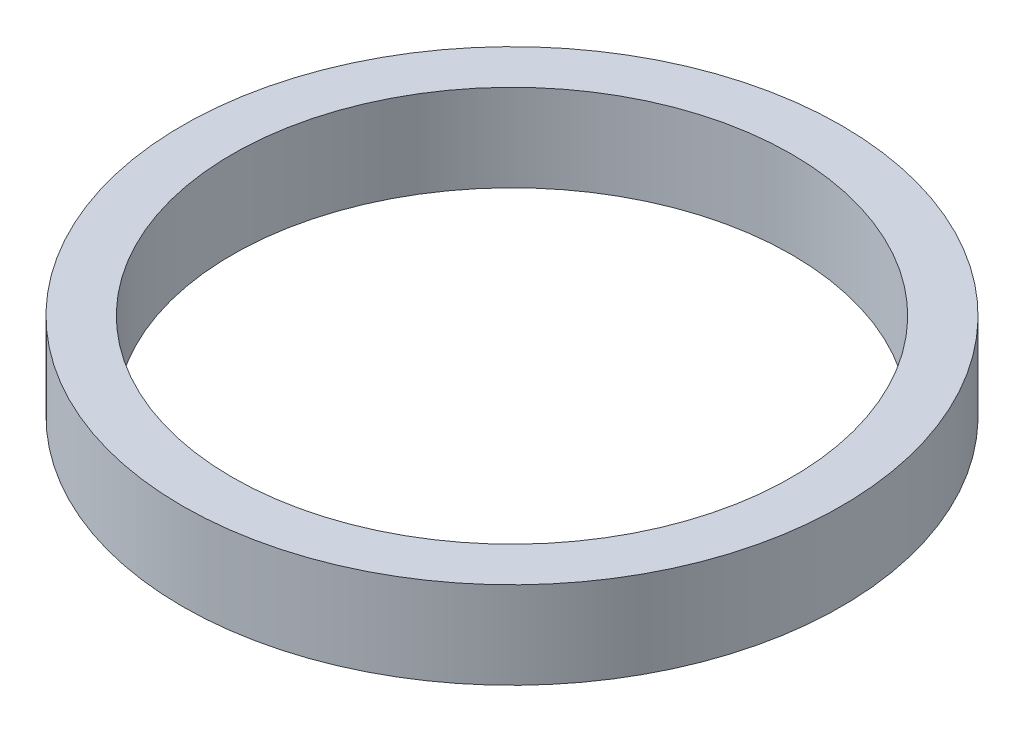
ISO-10303-21;
HEADER;
FILE_DESCRIPTION(('STEP AP214'),'2;1');
FILE_NAME('part.step','',(''),(''),'','','');
FILE_SCHEMA(('AUTOMOTIVE_DESIGN { 1 0 10303 214 1 1 1 1 }'));
ENDSEC;
DATA;
#1=APPLICATION_CONTEXT('core data for automotive mechanical design processes');
#2=APPLICATION_PROTOCOL_DEFINITION('international standard','automotive_design',2000,#1);
#3=PRODUCT_CONTEXT('',#1,'mechanical');
#4=PRODUCT('Part','Part','',(#3));
#5=PRODUCT_RELATED_PRODUCT_CATEGORY('part','',(#4));
#6=PRODUCT_DEFINITION_FORMATION('','',#4);
#7=PRODUCT_DEFINITION_CONTEXT('part definition',#1,'design');
#8=PRODUCT_DEFINITION('design','',#6,#7);
#9=PRODUCT_DEFINITION_SHAPE('','',#8);
#10=(LENGTH_UNIT() NAMED_UNIT(*) SI_UNIT(.MILLI.,.METRE.));
#11=(NAMED_UNIT(*) PLANE_ANGLE_UNIT() SI_UNIT($,.RADIAN.));
#12=(NAMED_UNIT(*) SI_UNIT($,.STERADIAN.) SOLID_ANGLE_UNIT());
#13=UNCERTAINTY_MEASURE_WITH_UNIT(LENGTH_MEASURE(1.E-05),#10,'distance_accuracy_value','');
#14=(GEOMETRIC_REPRESENTATION_CONTEXT(3) GLOBAL_UNCERTAINTY_ASSIGNED_CONTEXT((#13)) GLOBAL_UNIT_ASSIGNED_CONTEXT((#10,
#11,#12)) REPRESENTATION_CONTEXT('',''));
#15=CARTESIAN_POINT('',(0.,0.,0.));
#16=DIRECTION('',(0.,0.,1.));
#17=DIRECTION('',(1.,0.,0.));
#18=AXIS2_PLACEMENT_3D('',#15,#16,#17);
#19=CARTESIAN_POINT('',(0.,14.,0.));
#20=DIRECTION('',(0.,1.,0.));
#21=DIRECTION('',(0.,0.,1.));
#22=AXIS2_PLACEMENT_3D('',#19,#20,#21);
#23=PLANE('',#22);
#24=CARTESIAN_POINT('',(0.,14.,0.));
#25=DIRECTION('',(0.,1.,0.));
#26=DIRECTION('',(0.,0.,1.));
#27=AXIS2_PLACEMENT_3D('',#24,#25,#26);
#28=CIRCLE('',#27,53.);
#29=CARTESIAN_POINT('',(0.,14.,53.));
#30=VERTEX_POINT('',#29);
#31=EDGE_CURVE('E10',#30,#30,#28,.T.);
#32=ORIENTED_EDGE('',*,*,#31,.T.);
#33=EDGE_LOOP('',(#32));
#34=FACE_BOUND('',#33,.T.);
#35=CARTESIAN_POINT('',(0.,14.,0.));
#36=DIRECTION('',(0.,1.,0.));
#37=DIRECTION('',(0.,0.,1.));
#38=AXIS2_PLACEMENT_3D('',#35,#36,#37);
#39=CIRCLE('',#38,45.);
#40=CARTESIAN_POINT('',(0.,14.,45.));
#41=VERTEX_POINT('',#40);
#42=EDGE_CURVE('E57',#41,#41,#39,.T.);
#43=ORIENTED_EDGE('',*,*,#42,.F.);
#44=EDGE_LOOP('',(#43));
#45=FACE_BOUND('',#44,.T.);
#46=ADVANCED_FACE('F42',(#34,#45),#23,.T.);
#47=CARTESIAN_POINT('',(0.,0.,0.));
#48=DIRECTION('',(0.,1.,0.));
#49=DIRECTION('',(0.,0.,1.));
#50=AXIS2_PLACEMENT_3D('',#47,#48,#49);
#51=PLANE('',#50);
#52=CARTESIAN_POINT('',(0.,0.,49.));
#53=DIRECTION('',(0.,-1.,0.));
#54=DIRECTION('',(0.,0.,-1.));
#55=AXIS2_PLACEMENT_3D('',#52,#53,#54);
#56=CIRCLE('',#55,2.4);
#57=CARTESIAN_POINT('',(0.,0.,46.6));
#58=VERTEX_POINT('',#57);
#59=EDGE_CURVE('E121',#58,#58,#56,.T.);
#60=ORIENTED_EDGE('',*,*,#59,.F.);
#61=EDGE_LOOP('',(#60));
#62=FACE_BOUND('',#61,.T.);
#63=CARTESIAN_POINT('',(-42.4352447854372,0.,24.5000000000005));
#64=DIRECTION('',(0.,-1.,0.));
#65=DIRECTION('',(0.,0.,-1.));
#66=AXIS2_PLACEMENT_3D('',#63,#64,#65);
#67=CIRCLE('',#66,2.4);
#68=CARTESIAN_POINT('',(-42.4352447854372,0.,22.1000000000005));
#69=VERTEX_POINT('',#68);
#70=EDGE_CURVE('E91',#69,#69,#67,.T.);
#71=ORIENTED_EDGE('',*,*,#70,.F.);
#72=EDGE_LOOP('',(#71));
#73=FACE_BOUND('',#72,.T.);
#74=CARTESIAN_POINT('',(-3.36945749079831E-13,0.,-49.));
#75=DIRECTION('',(0.,-1.,0.));
#76=DIRECTION('',(0.,0.,-1.));
#77=AXIS2_PLACEMENT_3D('',#74,#75,#76);
#78=CIRCLE('',#77,2.4);
#79=CARTESIAN_POINT('',(-3.36945749079831E-13,0.,-51.4));
#80=VERTEX_POINT('',#79);
#81=EDGE_CURVE('E117',#80,#80,#78,.T.);
#82=ORIENTED_EDGE('',*,*,#81,.F.);
#83=EDGE_LOOP('',(#82));
#84=FACE_BOUND('',#83,.T.);
#85=CARTESIAN_POINT('',(42.4352447854379,0.,24.4999999999993));
#86=DIRECTION('',(0.,-1.,0.));
#87=DIRECTION('',(0.,0.,-1.));
#88=AXIS2_PLACEMENT_3D('',#85,#86,#87);
#89=CIRCLE('',#88,2.40000000000022);
#90=CARTESIAN_POINT('',(42.4352447854379,0.,22.0999999999991));
#91=VERTEX_POINT('',#90);
#92=EDGE_CURVE('E126',#91,#91,#89,.T.);
#93=ORIENTED_EDGE('',*,*,#92,.F.);
#94=EDGE_LOOP('',(#93));
#95=FACE_BOUND('',#94,.T.);
#96=CARTESIAN_POINT('',(42.4352447854374,0.,-24.5000000000002));
#97=DIRECTION('',(0.,-1.,0.));
#98=DIRECTION('',(0.,0.,-1.));
#99=AXIS2_PLACEMENT_3D('',#96,#97,#98);
#100=CIRCLE('',#99,2.40000000000045);
#101=CARTESIAN_POINT('',(42.4352447854374,0.,-26.9000000000006));
#102=VERTEX_POINT('',#101);
#103=EDGE_CURVE('E101',#102,#102,#100,.T.);
#104=ORIENTED_EDGE('',*,*,#103,.F.);
#105=EDGE_LOOP('',(#104));
#106=FACE_BOUND('',#105,.T.);
#107=CARTESIAN_POINT('',(-42.4352447854377,0.,-24.4999999999996));
#108=DIRECTION('',(0.,-1.,0.));
#109=DIRECTION('',(0.,0.,-1.));
#110=AXIS2_PLACEMENT_3D('',#107,#108,#109);
#111=CIRCLE('',#110,2.4);
#112=CARTESIAN_POINT('',(-42.4352447854377,0.,-26.8999999999996));
#113=VERTEX_POINT('',#112);
#114=EDGE_CURVE('E110',#113,#113,#111,.T.);
#115=ORIENTED_EDGE('',*,*,#114,.F.);
#116=EDGE_LOOP('',(#115));
#117=FACE_BOUND('',#116,.T.);
#118=CARTESIAN_POINT('',(0.,0.,0.));
#119=DIRECTION('',(0.,1.,0.));
#120=DIRECTION('',(0.,0.,1.));
#121=AXIS2_PLACEMENT_3D('',#118,#119,#120);
#122=CIRCLE('',#121,53.);
#123=CARTESIAN_POINT('',(0.,0.,53.));
#124=VERTEX_POINT('',#123);
#125=EDGE_CURVE('E51',#124,#124,#122,.T.);
#126=ORIENTED_EDGE('',*,*,#125,.F.);
#127=EDGE_LOOP('',(#126));
#128=FACE_BOUND('',#127,.T.);
#129=CARTESIAN_POINT('',(0.,0.,0.));
#130=DIRECTION('',(0.,1.,0.));
#131=DIRECTION('',(0.,0.,1.));
#132=AXIS2_PLACEMENT_3D('',#129,#130,#131);
#133=CIRCLE('',#132,45.);
#134=CARTESIAN_POINT('',(0.,0.,45.));
#135=VERTEX_POINT('',#134);
#136=EDGE_CURVE('E60',#135,#135,#133,.T.);
#137=ORIENTED_EDGE('',*,*,#136,.T.);
#138=EDGE_LOOP('',(#137));
#139=FACE_BOUND('',#138,.T.);
#140=ADVANCED_FACE('F191',(#62,#73,#84,#95,#106,#117,#128,#139),#51,.F.);
#141=CARTESIAN_POINT('',(0.,14.,0.));
#142=DIRECTION('',(0.,-1.,0.));
#143=DIRECTION('',(0.,0.,-1.));
#144=AXIS2_PLACEMENT_3D('',#141,#142,#143);
#145=CYLINDRICAL_SURFACE('',#144,53.);
#146=ORIENTED_EDGE('',*,*,#31,.F.);
#147=EDGE_LOOP('',(#146));
#148=FACE_BOUND('',#147,.T.);
#149=ORIENTED_EDGE('',*,*,#125,.T.);
#150=EDGE_LOOP('',(#149));
#151=FACE_BOUND('',#150,.T.);
#152=ADVANCED_FACE('F44',(#148,#151),#145,.T.);
#153=CARTESIAN_POINT('',(0.,14.,0.));
#154=DIRECTION('',(0.,-1.,0.));
#155=DIRECTION('',(0.,0.,-1.));
#156=AXIS2_PLACEMENT_3D('',#153,#154,#155);
#157=CYLINDRICAL_SURFACE('',#156,45.);
#158=ORIENTED_EDGE('',*,*,#42,.T.);
#159=EDGE_LOOP('',(#158));
#160=FACE_BOUND('',#159,.T.);
#161=ORIENTED_EDGE('',*,*,#136,.F.);
#162=EDGE_LOOP('',(#161));
#163=FACE_BOUND('',#162,.T.);
#164=ADVANCED_FACE('F200',(#160,#163),#157,.F.);
#165=CARTESIAN_POINT('',(-42.4352447854377,4.,-24.4999999999996));
#166=DIRECTION('',(0.,-1.,0.));
#167=DIRECTION('',(0.,0.,-1.));
#168=AXIS2_PLACEMENT_3D('',#165,#166,#167);
#169=CYLINDRICAL_SURFACE('',#168,2.4);
#170=CARTESIAN_POINT('',(-42.4352447854377,4.,-24.4999999999996));
#171=DIRECTION('',(0.,-1.,0.));
#172=DIRECTION('',(0.,0.,-1.));
#173=AXIS2_PLACEMENT_3D('',#170,#171,#172);
#174=CIRCLE('',#173,2.4);
#175=CARTESIAN_POINT('',(-42.4352447854377,4.,-26.8999999999996));
#176=VERTEX_POINT('',#175);
#177=EDGE_CURVE('E97',#176,#176,#174,.T.);
#178=ORIENTED_EDGE('',*,*,#177,.F.);
#179=EDGE_LOOP('',(#178));
#180=FACE_BOUND('',#179,.T.);
#181=ORIENTED_EDGE('',*,*,#114,.T.);
#182=EDGE_LOOP('',(#181));
#183=FACE_BOUND('',#182,.T.);
#184=ADVANCED_FACE('F203',(#180,#183),#169,.F.);
#185=CARTESIAN_POINT('',(-42.4352447854377,4.,-24.4999999999996));
#186=DIRECTION('',(0.,-1.,0.));
#187=DIRECTION('',(0.,0.,-1.));
#188=AXIS2_PLACEMENT_3D('',#185,#186,#187);
#189=PLANE('',#188);
#190=CARTESIAN_POINT('',(-42.4352447854377,4.,-24.4999999999996));
#191=DIRECTION('',(0.,-1.,0.));
#192=DIRECTION('',(0.,0.,-1.));
#193=AXIS2_PLACEMENT_3D('',#190,#191,#192);
#194=CIRCLE('',#193,1.6);
#195=CARTESIAN_POINT('',(-42.4352447854377,4.,-26.0999999999996));
#196=VERTEX_POINT('',#195);
#197=EDGE_CURVE('E46',#196,#196,#194,.T.);
#198=ORIENTED_EDGE('',*,*,#197,.F.);
#199=EDGE_LOOP('',(#198));
#200=FACE_BOUND('',#199,.T.);
#201=ORIENTED_EDGE('',*,*,#177,.T.);
#202=EDGE_LOOP('',(#201));
#203=FACE_BOUND('',#202,.T.);
#204=ADVANCED_FACE('F222',(#200,#203),#189,.T.);
#205=CARTESIAN_POINT('',(42.4352447854374,4.,-24.5000000000002));
#206=DIRECTION('',(0.,-1.,0.));
#207=DIRECTION('',(0.,0.,-1.));
#208=AXIS2_PLACEMENT_3D('',#205,#206,#207);
#209=CYLINDRICAL_SURFACE('',#208,2.40000000000045);
#210=CARTESIAN_POINT('',(42.4352447854374,4.,-24.5000000000002));
#211=DIRECTION('',(0.,-1.,0.));
#212=DIRECTION('',(0.,0.,-1.));
#213=AXIS2_PLACEMENT_3D('',#210,#211,#212);
#214=CIRCLE('',#213,2.40000000000045);
#215=CARTESIAN_POINT('',(42.4352447854374,4.,-26.9000000000006));
#216=VERTEX_POINT('',#215);
#217=EDGE_CURVE('E106',#216,#216,#214,.T.);
#218=ORIENTED_EDGE('',*,*,#217,.F.);
#219=EDGE_LOOP('',(#218));
#220=FACE_BOUND('',#219,.T.);
#221=ORIENTED_EDGE('',*,*,#103,.T.);
#222=EDGE_LOOP('',(#221));
#223=FACE_BOUND('',#222,.T.);
#224=ADVANCED_FACE('F225',(#220,#223),#209,.F.);
#225=CARTESIAN_POINT('',(42.4352447854374,4.,-24.5000000000002));
#226=DIRECTION('',(0.,-1.,0.));
#227=DIRECTION('',(0.,0.,-1.));
#228=AXIS2_PLACEMENT_3D('',#225,#226,#227);
#229=PLANE('',#228);
#230=CARTESIAN_POINT('',(42.4352447854374,4.,-24.5000000000002));
#231=DIRECTION('',(0.,-1.,0.));
#232=DIRECTION('',(0.,0.,-1.));
#233=AXIS2_PLACEMENT_3D('',#230,#231,#232);
#234=CIRCLE('',#233,1.6);
#235=CARTESIAN_POINT('',(42.4352447854374,4.,-26.1000000000002));
#236=VERTEX_POINT('',#235);
#237=EDGE_CURVE('E79',#236,#236,#234,.T.);
#238=ORIENTED_EDGE('',*,*,#237,.F.);
#239=EDGE_LOOP('',(#238));
#240=FACE_BOUND('',#239,.T.);
#241=ORIENTED_EDGE('',*,*,#217,.T.);
#242=EDGE_LOOP('',(#241));
#243=FACE_BOUND('',#242,.T.);
#244=ADVANCED_FACE('F212',(#240,#243),#229,.T.);
#245=CARTESIAN_POINT('',(42.4352447854379,4.,24.4999999999993));
#246=DIRECTION('',(0.,-1.,0.));
#247=DIRECTION('',(0.,0.,-1.));
#248=AXIS2_PLACEMENT_3D('',#245,#246,#247);
#249=CYLINDRICAL_SURFACE('',#248,2.40000000000022);
#250=CARTESIAN_POINT('',(42.4352447854379,4.,24.4999999999993));
#251=DIRECTION('',(0.,-1.,0.));
#252=DIRECTION('',(0.,0.,-1.));
#253=AXIS2_PLACEMENT_3D('',#250,#251,#252);
#254=CIRCLE('',#253,2.40000000000022);
#255=CARTESIAN_POINT('',(42.4352447854379,4.,22.0999999999991));
#256=VERTEX_POINT('',#255);
#257=EDGE_CURVE('E105',#256,#256,#254,.T.);
#258=ORIENTED_EDGE('',*,*,#257,.F.);
#259=EDGE_LOOP('',(#258));
#260=FACE_BOUND('',#259,.T.);
#261=ORIENTED_EDGE('',*,*,#92,.T.);
#262=EDGE_LOOP('',(#261));
#263=FACE_BOUND('',#262,.T.);
#264=ADVANCED_FACE('F208',(#260,#263),#249,.F.);
#265=CARTESIAN_POINT('',(42.4352447854379,4.,24.4999999999993));
#266=DIRECTION('',(0.,-1.,0.));
#267=DIRECTION('',(0.,0.,-1.));
#268=AXIS2_PLACEMENT_3D('',#265,#266,#267);
#269=PLANE('',#268);
#270=CARTESIAN_POINT('',(42.4352447854379,4.,24.4999999999993));
#271=DIRECTION('',(0.,-1.,0.));
#272=DIRECTION('',(0.,0.,-1.));
#273=AXIS2_PLACEMENT_3D('',#270,#271,#272);
#274=CIRCLE('',#273,1.6);
#275=CARTESIAN_POINT('',(42.4352447854379,4.,22.8999999999993));
#276=VERTEX_POINT('',#275);
#277=EDGE_CURVE('E76',#276,#276,#274,.T.);
#278=ORIENTED_EDGE('',*,*,#277,.F.);
#279=EDGE_LOOP('',(#278));
#280=FACE_BOUND('',#279,.T.);
#281=ORIENTED_EDGE('',*,*,#257,.T.);
#282=EDGE_LOOP('',(#281));
#283=FACE_BOUND('',#282,.T.);
#284=ADVANCED_FACE('F204',(#280,#283),#269,.T.);
#285=CARTESIAN_POINT('',(-3.36945749079831E-13,4.,-49.));
#286=DIRECTION('',(0.,-1.,0.));
#287=DIRECTION('',(0.,0.,-1.));
#288=AXIS2_PLACEMENT_3D('',#285,#286,#287);
#289=CYLINDRICAL_SURFACE('',#288,2.4);
#290=CARTESIAN_POINT('',(-3.36945749079831E-13,4.,-49.));
#291=DIRECTION('',(0.,-1.,0.));
#292=DIRECTION('',(0.,0.,-1.));
#293=AXIS2_PLACEMENT_3D('',#290,#291,#292);
#294=CIRCLE('',#293,2.4);
#295=CARTESIAN_POINT('',(-3.36945749079831E-13,4.,-51.4));
#296=VERTEX_POINT('',#295);
#297=EDGE_CURVE('E122',#296,#296,#294,.T.);
#298=ORIENTED_EDGE('',*,*,#297,.F.);
#299=EDGE_LOOP('',(#298));
#300=FACE_BOUND('',#299,.T.);
#301=ORIENTED_EDGE('',*,*,#81,.T.);
#302=EDGE_LOOP('',(#301));
#303=FACE_BOUND('',#302,.T.);
#304=ADVANCED_FACE('F207',(#300,#303),#289,.F.);
#305=CARTESIAN_POINT('',(-3.36945749079831E-13,4.,-49.));
#306=DIRECTION('',(0.,-1.,0.));
#307=DIRECTION('',(0.,0.,-1.));
#308=AXIS2_PLACEMENT_3D('',#305,#306,#307);
#309=PLANE('',#308);
#310=CARTESIAN_POINT('',(-3.36945749079831E-13,4.,-49.));
#311=DIRECTION('',(0.,-1.,0.));
#312=DIRECTION('',(0.,0.,-1.));
#313=AXIS2_PLACEMENT_3D('',#310,#311,#312);
#314=CIRCLE('',#313,1.6);
#315=CARTESIAN_POINT('',(-3.36945749079831E-13,4.,-50.6));
#316=VERTEX_POINT('',#315);
#317=EDGE_CURVE('E72',#316,#316,#314,.T.);
#318=ORIENTED_EDGE('',*,*,#317,.F.);
#319=EDGE_LOOP('',(#318));
#320=FACE_BOUND('',#319,.T.);
#321=ORIENTED_EDGE('',*,*,#297,.T.);
#322=EDGE_LOOP('',(#321));
#323=FACE_BOUND('',#322,.T.);
#324=ADVANCED_FACE('F214',(#320,#323),#309,.T.);
#325=CARTESIAN_POINT('',(-42.4352447854372,4.,24.5000000000005));
#326=DIRECTION('',(0.,-1.,0.));
#327=DIRECTION('',(0.,0.,-1.));
#328=AXIS2_PLACEMENT_3D('',#325,#326,#327);
#329=CYLINDRICAL_SURFACE('',#328,2.4);
#330=CARTESIAN_POINT('',(-42.4352447854372,4.,24.5000000000005));
#331=DIRECTION('',(0.,-1.,0.));
#332=DIRECTION('',(0.,0.,-1.));
#333=AXIS2_PLACEMENT_3D('',#330,#331,#332);
#334=CIRCLE('',#333,2.4);
#335=CARTESIAN_POINT('',(-42.4352447854372,4.,22.1000000000005));
#336=VERTEX_POINT('',#335);
#337=EDGE_CURVE('E86',#336,#336,#334,.T.);
#338=ORIENTED_EDGE('',*,*,#337,.F.);
#339=EDGE_LOOP('',(#338));
#340=FACE_BOUND('',#339,.T.);
#341=ORIENTED_EDGE('',*,*,#70,.T.);
#342=EDGE_LOOP('',(#341));
#343=FACE_BOUND('',#342,.T.);
#344=ADVANCED_FACE('F217',(#340,#343),#329,.F.);
#345=CARTESIAN_POINT('',(-42.4352447854372,4.,24.5000000000005));
#346=DIRECTION('',(0.,-1.,0.));
#347=DIRECTION('',(0.,0.,-1.));
#348=AXIS2_PLACEMENT_3D('',#345,#346,#347);
#349=PLANE('',#348);
#350=CARTESIAN_POINT('',(-42.4352447854372,4.,24.5000000000005));
#351=DIRECTION('',(0.,-1.,0.));
#352=DIRECTION('',(0.,0.,-1.));
#353=AXIS2_PLACEMENT_3D('',#350,#351,#352);
#354=CIRCLE('',#353,1.6);
#355=CARTESIAN_POINT('',(-42.4352447854372,4.,22.9000000000005));
#356=VERTEX_POINT('',#355);
#357=EDGE_CURVE('E67',#356,#356,#354,.T.);
#358=ORIENTED_EDGE('',*,*,#357,.F.);
#359=EDGE_LOOP('',(#358));
#360=FACE_BOUND('',#359,.T.);
#361=ORIENTED_EDGE('',*,*,#337,.T.);
#362=EDGE_LOOP('',(#361));
#363=FACE_BOUND('',#362,.T.);
#364=ADVANCED_FACE('F236',(#360,#363),#349,.T.);
#365=CARTESIAN_POINT('',(0.,4.,49.));
#366=DIRECTION('',(0.,-1.,0.));
#367=DIRECTION('',(0.,0.,-1.));
#368=AXIS2_PLACEMENT_3D('',#365,#366,#367);
#369=CYLINDRICAL_SURFACE('',#368,2.4);
#370=CARTESIAN_POINT('',(0.,4.,49.));
#371=DIRECTION('',(0.,-1.,0.));
#372=DIRECTION('',(0.,0.,-1.));
#373=AXIS2_PLACEMENT_3D('',#370,#371,#372);
#374=CIRCLE('',#373,2.4);
#375=CARTESIAN_POINT('',(0.,4.,46.6));
#376=VERTEX_POINT('',#375);
#377=EDGE_CURVE('E138',#376,#376,#374,.T.);
#378=ORIENTED_EDGE('',*,*,#377,.F.);
#379=EDGE_LOOP('',(#378));
#380=FACE_BOUND('',#379,.T.);
#381=ORIENTED_EDGE('',*,*,#59,.T.);
#382=EDGE_LOOP('',(#381));
#383=FACE_BOUND('',#382,.T.);
#384=ADVANCED_FACE('F186',(#380,#383),#369,.F.);
#385=CARTESIAN_POINT('',(0.,4.,49.));
#386=DIRECTION('',(0.,-1.,0.));
#387=DIRECTION('',(0.,0.,-1.));
#388=AXIS2_PLACEMENT_3D('',#385,#386,#387);
#389=PLANE('',#388);
#390=CARTESIAN_POINT('',(0.,4.,49.));
#391=DIRECTION('',(0.,-1.,0.));
#392=DIRECTION('',(0.,0.,-1.));
#393=AXIS2_PLACEMENT_3D('',#390,#391,#392);
#394=CIRCLE('',#393,1.6);
#395=CARTESIAN_POINT('',(0.,4.,47.4));
#396=VERTEX_POINT('',#395);
#397=EDGE_CURVE('E63',#396,#396,#394,.T.);
#398=ORIENTED_EDGE('',*,*,#397,.F.);
#399=EDGE_LOOP('',(#398));
#400=FACE_BOUND('',#399,.T.);
#401=ORIENTED_EDGE('',*,*,#377,.T.);
#402=EDGE_LOOP('',(#401));
#403=FACE_BOUND('',#402,.T.);
#404=ADVANCED_FACE('F177',(#400,#403),#389,.T.);
#405=CARTESIAN_POINT('',(0.,6.,49.));
#406=DIRECTION('',(0.,-1.,0.));
#407=DIRECTION('',(0.,0.,-1.));
#408=AXIS2_PLACEMENT_3D('',#405,#406,#407);
#409=CYLINDRICAL_SURFACE('',#408,1.6);
#410=ORIENTED_EDGE('',*,*,#397,.T.);
#411=EDGE_LOOP('',(#410));
#412=FACE_BOUND('',#411,.T.);
#413=CARTESIAN_POINT('',(0.,6.,49.));
#414=DIRECTION('',(0.,-1.,0.));
#415=DIRECTION('',(0.,0.,-1.));
#416=AXIS2_PLACEMENT_3D('',#413,#414,#415);
#417=CIRCLE('',#416,1.6);
#418=CARTESIAN_POINT('',(0.,6.,47.4));
#419=VERTEX_POINT('',#418);
#420=EDGE_CURVE('E68',#419,#419,#417,.T.);
#421=ORIENTED_EDGE('',*,*,#420,.F.);
#422=EDGE_LOOP('',(#421));
#423=FACE_BOUND('',#422,.T.);
#424=ADVANCED_FACE('F175',(#412,#423),#409,.F.);
#425=CARTESIAN_POINT('',(0.,6.,49.));
#426=DIRECTION('',(0.,-1.,0.));
#427=DIRECTION('',(0.,0.,-1.));
#428=AXIS2_PLACEMENT_3D('',#425,#426,#427);
#429=PLANE('',#428);
#430=ORIENTED_EDGE('',*,*,#420,.T.);
#431=EDGE_LOOP('',(#430));
#432=FACE_BOUND('',#431,.T.);
#433=ADVANCED_FACE('F173',(#432),#429,.T.);
#434=CARTESIAN_POINT('',(-42.4352447854372,6.,24.5000000000005));
#435=DIRECTION('',(0.,-1.,0.));
#436=DIRECTION('',(0.,0.,-1.));
#437=AXIS2_PLACEMENT_3D('',#434,#435,#436);
#438=CYLINDRICAL_SURFACE('',#437,1.6);
#439=ORIENTED_EDGE('',*,*,#357,.T.);
#440=EDGE_LOOP('',(#439));
#441=FACE_BOUND('',#440,.T.);
#442=CARTESIAN_POINT('',(-42.4352447854372,6.,24.5000000000005));
#443=DIRECTION('',(0.,-1.,0.));
#444=DIRECTION('',(0.,0.,-1.));
#445=AXIS2_PLACEMENT_3D('',#442,#443,#444);
#446=CIRCLE('',#445,1.6);
#447=CARTESIAN_POINT('',(-42.4352447854372,6.,22.9000000000005));
#448=VERTEX_POINT('',#447);
#449=EDGE_CURVE('E149',#448,#448,#446,.T.);
#450=ORIENTED_EDGE('',*,*,#449,.F.);
#451=EDGE_LOOP('',(#450));
#452=FACE_BOUND('',#451,.T.);
#453=ADVANCED_FACE('F184',(#441,#452),#438,.F.);
#454=CARTESIAN_POINT('',(-42.4352447854372,6.,24.5000000000005));
#455=DIRECTION('',(0.,-1.,0.));
#456=DIRECTION('',(0.,0.,-1.));
#457=AXIS2_PLACEMENT_3D('',#454,#455,#456);
#458=PLANE('',#457);
#459=ORIENTED_EDGE('',*,*,#449,.T.);
#460=EDGE_LOOP('',(#459));
#461=FACE_BOUND('',#460,.T.);
#462=ADVANCED_FACE('F246',(#461),#458,.T.);
#463=CARTESIAN_POINT('',(-3.36945749079831E-13,6.,-49.));
#464=DIRECTION('',(0.,-1.,0.));
#465=DIRECTION('',(0.,0.,-1.));
#466=AXIS2_PLACEMENT_3D('',#463,#464,#465);
#467=CYLINDRICAL_SURFACE('',#466,1.6);
#468=ORIENTED_EDGE('',*,*,#317,.T.);
#469=EDGE_LOOP('',(#468));
#470=FACE_BOUND('',#469,.T.);
#471=CARTESIAN_POINT('',(-3.36945749079831E-13,6.,-49.));
#472=DIRECTION('',(0.,-1.,0.));
#473=DIRECTION('',(0.,0.,-1.));
#474=AXIS2_PLACEMENT_3D('',#471,#472,#473);
#475=CIRCLE('',#474,1.6);
#476=CARTESIAN_POINT('',(-3.36945749079831E-13,6.,-50.6));
#477=VERTEX_POINT('',#476);
#478=EDGE_CURVE('E153',#477,#477,#475,.T.);
#479=ORIENTED_EDGE('',*,*,#478,.F.);
#480=EDGE_LOOP('',(#479));
#481=FACE_BOUND('',#480,.T.);
#482=ADVANCED_FACE('F249',(#470,#481),#467,.F.);
#483=CARTESIAN_POINT('',(-3.36945749079831E-13,6.,-49.));
#484=DIRECTION('',(0.,-1.,0.));
#485=DIRECTION('',(0.,0.,-1.));
#486=AXIS2_PLACEMENT_3D('',#483,#484,#485);
#487=PLANE('',#486);
#488=ORIENTED_EDGE('',*,*,#478,.T.);
#489=EDGE_LOOP('',(#488));
#490=FACE_BOUND('',#489,.T.);
#491=ADVANCED_FACE('F254',(#490),#487,.T.);
#492=CARTESIAN_POINT('',(42.4352447854379,6.,24.4999999999993));
#493=DIRECTION('',(0.,-1.,0.));
#494=DIRECTION('',(0.,0.,-1.));
#495=AXIS2_PLACEMENT_3D('',#492,#493,#494);
#496=CYLINDRICAL_SURFACE('',#495,1.6);
#497=ORIENTED_EDGE('',*,*,#277,.T.);
#498=EDGE_LOOP('',(#497));
#499=FACE_BOUND('',#498,.T.);
#500=CARTESIAN_POINT('',(42.4352447854379,6.,24.4999999999993));
#501=DIRECTION('',(0.,-1.,0.));
#502=DIRECTION('',(0.,0.,-1.));
#503=AXIS2_PLACEMENT_3D('',#500,#501,#502);
#504=CIRCLE('',#503,1.6);
#505=CARTESIAN_POINT('',(42.4352447854379,6.,22.8999999999993));
#506=VERTEX_POINT('',#505);
#507=EDGE_CURVE('E162',#506,#506,#504,.T.);
#508=ORIENTED_EDGE('',*,*,#507,.F.);
#509=EDGE_LOOP('',(#508));
#510=FACE_BOUND('',#509,.T.);
#511=ADVANCED_FACE('F257',(#499,#510),#496,.F.);
#512=CARTESIAN_POINT('',(42.4352447854379,6.,24.4999999999993));
#513=DIRECTION('',(0.,-1.,0.));
#514=DIRECTION('',(0.,0.,-1.));
#515=AXIS2_PLACEMENT_3D('',#512,#513,#514);
#516=PLANE('',#515);
#517=ORIENTED_EDGE('',*,*,#507,.T.);
#518=EDGE_LOOP('',(#517));
#519=FACE_BOUND('',#518,.T.);
#520=ADVANCED_FACE('F270',(#519),#516,.T.);
#521=CARTESIAN_POINT('',(42.4352447854374,6.,-24.5000000000002));
#522=DIRECTION('',(0.,-1.,0.));
#523=DIRECTION('',(0.,0.,-1.));
#524=AXIS2_PLACEMENT_3D('',#521,#522,#523);
#525=CYLINDRICAL_SURFACE('',#524,1.6);
#526=ORIENTED_EDGE('',*,*,#237,.T.);
#527=EDGE_LOOP('',(#526));
#528=FACE_BOUND('',#527,.T.);
#529=CARTESIAN_POINT('',(42.4352447854374,6.,-24.5000000000002));
#530=DIRECTION('',(0.,-1.,0.));
#531=DIRECTION('',(0.,0.,-1.));
#532=AXIS2_PLACEMENT_3D('',#529,#530,#531);
#533=CIRCLE('',#532,1.6);
#534=CARTESIAN_POINT('',(42.4352447854374,6.,-26.1000000000002));
#535=VERTEX_POINT('',#534);
#536=EDGE_CURVE('E158',#535,#535,#533,.T.);
#537=ORIENTED_EDGE('',*,*,#536,.F.);
#538=EDGE_LOOP('',(#537));
#539=FACE_BOUND('',#538,.T.);
#540=ADVANCED_FACE('F266',(#528,#539),#525,.F.);
#541=CARTESIAN_POINT('',(42.4352447854374,6.,-24.5000000000002));
#542=DIRECTION('',(0.,-1.,0.));
#543=DIRECTION('',(0.,0.,-1.));
#544=AXIS2_PLACEMENT_3D('',#541,#542,#543);
#545=PLANE('',#544);
#546=ORIENTED_EDGE('',*,*,#536,.T.);
#547=EDGE_LOOP('',(#546));
#548=FACE_BOUND('',#547,.T.);
#549=ADVANCED_FACE('F262',(#548),#545,.T.);
#550=CARTESIAN_POINT('',(-42.4352447854377,6.,-24.4999999999996));
#551=DIRECTION('',(0.,-1.,0.));
#552=DIRECTION('',(0.,0.,-1.));
#553=AXIS2_PLACEMENT_3D('',#550,#551,#552);
#554=CYLINDRICAL_SURFACE('',#553,1.6);
#555=ORIENTED_EDGE('',*,*,#197,.T.);
#556=EDGE_LOOP('',(#555));
#557=FACE_BOUND('',#556,.T.);
#558=CARTESIAN_POINT('',(-42.4352447854377,6.,-24.4999999999996));
#559=DIRECTION('',(0.,-1.,0.));
#560=DIRECTION('',(0.,0.,-1.));
#561=AXIS2_PLACEMENT_3D('',#558,#559,#560);
#562=CIRCLE('',#561,1.6);
#563=CARTESIAN_POINT('',(-42.4352447854377,6.,-26.0999999999996));
#564=VERTEX_POINT('',#563);
#565=EDGE_CURVE('E154',#564,#564,#562,.T.);
#566=ORIENTED_EDGE('',*,*,#565,.F.);
#567=EDGE_LOOP('',(#566));
#568=FACE_BOUND('',#567,.T.);
#569=ADVANCED_FACE('F265',(#557,#568),#554,.F.);
#570=CARTESIAN_POINT('',(-42.4352447854377,6.,-24.4999999999996));
#571=DIRECTION('',(0.,-1.,0.));
#572=DIRECTION('',(0.,0.,-1.));
#573=AXIS2_PLACEMENT_3D('',#570,#571,#572);
#574=PLANE('',#573);
#575=ORIENTED_EDGE('',*,*,#565,.T.);
#576=EDGE_LOOP('',(#575));
#577=FACE_BOUND('',#576,.T.);
#578=ADVANCED_FACE('F277',(#577),#574,.T.);
#579=CLOSED_SHELL('',(#46,#140,#152,#164,#184,#204,#224,#244,#264,#284,#304,#324,#344,#364,#384,
#404,#424,#433,#453,#462,#482,#491,#511,#520,#540,#549,#569,#578));
#580=MANIFOLD_SOLID_BREP('B2',#579);
#581=ADVANCED_BREP_SHAPE_REPRESENTATION('',(#18,#580),#14);
#582=SHAPE_DEFINITION_REPRESENTATION(#9,#581);
ENDSEC;
END-ISO-10303-21;
